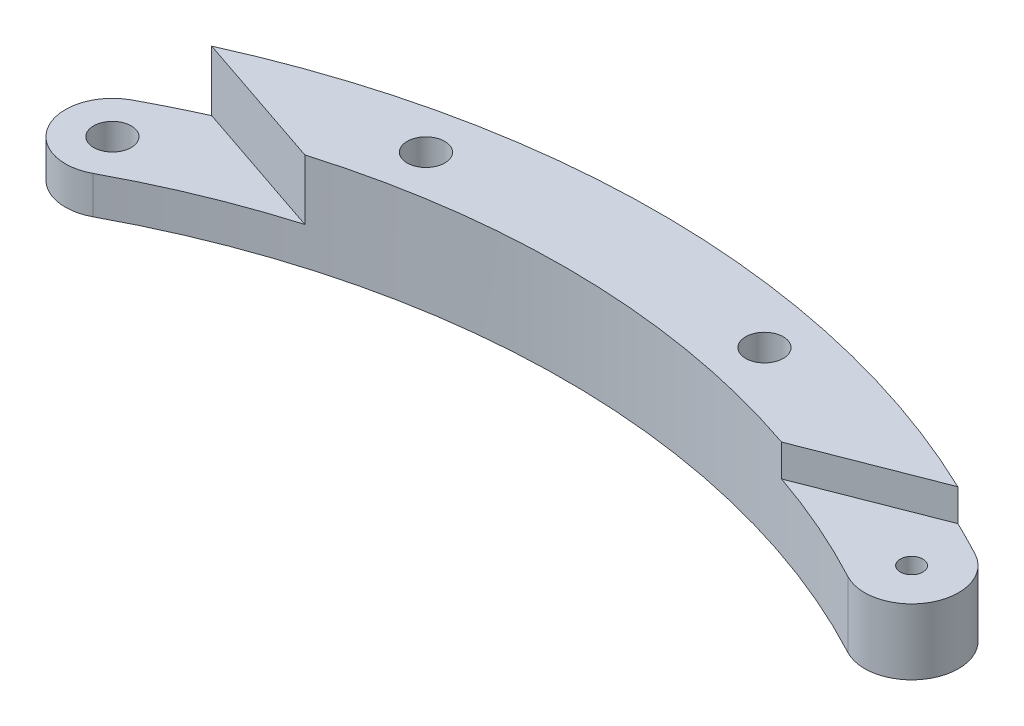
ISO-10303-21;
HEADER;
FILE_DESCRIPTION(('STEP AP214'),'2;1');
FILE_NAME('part.step','',(''),(''),'','','');
FILE_SCHEMA(('AUTOMOTIVE_DESIGN { 1 0 10303 214 1 1 1 1 }'));
ENDSEC;
DATA;
#1=APPLICATION_CONTEXT('core data for automotive mechanical design processes');
#2=APPLICATION_PROTOCOL_DEFINITION('international standard','automotive_design',2000,#1);
#3=PRODUCT_CONTEXT('',#1,'mechanical');
#4=PRODUCT('Part','Part','',(#3));
#5=PRODUCT_RELATED_PRODUCT_CATEGORY('part','',(#4));
#6=PRODUCT_DEFINITION_FORMATION('','',#4);
#7=PRODUCT_DEFINITION_CONTEXT('part definition',#1,'design');
#8=PRODUCT_DEFINITION('design','',#6,#7);
#9=PRODUCT_DEFINITION_SHAPE('','',#8);
#10=(LENGTH_UNIT() NAMED_UNIT(*) SI_UNIT(.MILLI.,.METRE.));
#11=(NAMED_UNIT(*) PLANE_ANGLE_UNIT() SI_UNIT($,.RADIAN.));
#12=(NAMED_UNIT(*) SI_UNIT($,.STERADIAN.) SOLID_ANGLE_UNIT());
#13=UNCERTAINTY_MEASURE_WITH_UNIT(LENGTH_MEASURE(1.E-05),#10,'distance_accuracy_value','');
#14=(GEOMETRIC_REPRESENTATION_CONTEXT(3) GLOBAL_UNCERTAINTY_ASSIGNED_CONTEXT((#13)) GLOBAL_UNIT_ASSIGNED_CONTEXT((#10,
#11,#12)) REPRESENTATION_CONTEXT('',''));
#15=CARTESIAN_POINT('',(0.,0.,0.));
#16=DIRECTION('',(0.,0.,1.));
#17=DIRECTION('',(1.,0.,0.));
#18=AXIS2_PLACEMENT_3D('',#15,#16,#17);
#19=CARTESIAN_POINT('',(0.,2.,0.));
#20=DIRECTION('',(0.,1.,0.));
#21=DIRECTION('',(0.,0.,1.));
#22=AXIS2_PLACEMENT_3D('',#19,#20,#21);
#23=PLANE('',#22);
#24=DIRECTION('',(0.947243114761475,0.,0.320515961438709));
#25=VECTOR('',#24,1.);
#26=CARTESIAN_POINT('',(1.26770156473888,2.,-3.74652661097153));
#27=LINE('',#26,#25);
#28=CARTESIAN_POINT('',(1.67034331371739,2.,-3.61028586635371));
#29=VERTEX_POINT('',#28);
#30=CARTESIAN_POINT('',(9.15765166258084,2.,-1.0768266132576));
#31=VERTEX_POINT('',#30);
#32=EDGE_CURVE('E81',#29,#31,#27,.T.);
#33=ORIENTED_EDGE('',*,*,#32,.F.);
#34=CARTESIAN_POINT('',(21.25,2.,39.6665791315561));
#35=DIRECTION('',(0.,1.,0.));
#36=DIRECTION('',(0.,0.,1.));
#37=AXIS2_PLACEMENT_3D('',#34,#35,#36);
#38=CIRCLE('',#37,47.5);
#39=CARTESIAN_POINT('',(-1.18055555555556,2.,-2.203698840642));
#40=VERTEX_POINT('',#39);
#41=EDGE_CURVE('E154',#40,#29,#38,.F.);
#42=ORIENTED_EDGE('',*,*,#41,.F.);
#43=CARTESIAN_POINT('',(0.,2.,0.));
#44=DIRECTION('',(0.,1.,0.));
#45=DIRECTION('',(0.,0.,1.));
#46=AXIS2_PLACEMENT_3D('',#43,#44,#45);
#47=CIRCLE('',#46,2.5);
#48=CARTESIAN_POINT('',(1.18055555555555,2.,2.203698840642));
#49=VERTEX_POINT('',#48);
#50=EDGE_CURVE('E157',#40,#49,#47,.T.);
#51=ORIENTED_EDGE('',*,*,#50,.T.);
#52=CARTESIAN_POINT('',(21.25,2.,39.6665791315561));
#53=DIRECTION('',(0.,1.,0.));
#54=DIRECTION('',(0.,0.,1.));
#55=AXIS2_PLACEMENT_3D('',#52,#53,#54);
#56=CIRCLE('',#55,42.5);
#57=EDGE_CURVE('E152',#49,#31,#56,.F.);
#58=ORIENTED_EDGE('',*,*,#57,.T.);
#59=EDGE_LOOP('',(#33,#42,#51,#58));
#60=FACE_BOUND('',#59,.T.);
#61=CARTESIAN_POINT('',(0.,2.,0.));
#62=DIRECTION('',(0.,1.,0.));
#63=DIRECTION('',(0.,0.,1.));
#64=AXIS2_PLACEMENT_3D('',#61,#62,#63);
#65=CIRCLE('',#64,1.);
#66=CARTESIAN_POINT('',(0.,2.,1.));
#67=VERTEX_POINT('',#66);
#68=EDGE_CURVE('E159',#67,#67,#65,.T.);
#69=ORIENTED_EDGE('',*,*,#68,.F.);
#70=EDGE_LOOP('',(#69));
#71=FACE_BOUND('',#70,.T.);
#72=ADVANCED_FACE('F58',(#60,#71),#23,.T.);
#73=CARTESIAN_POINT('',(21.25,2.,39.6665791315561));
#74=DIRECTION('',(0.,-1.,0.));
#75=DIRECTION('',(0.,0.,-1.));
#76=AXIS2_PLACEMENT_3D('',#73,#74,#75);
#77=CYLINDRICAL_SURFACE('',#76,42.5);
#78=DIRECTION('',(0.,-1.,0.));
#79=VECTOR('',#78,1.);
#80=CARTESIAN_POINT('',(41.3194444444444,2.,2.203698840642));
#81=LINE('',#80,#79);
#82=CARTESIAN_POINT('',(41.3194444444444,3.5,2.203698840642));
#83=VERTEX_POINT('',#82);
#84=CARTESIAN_POINT('',(41.3194444444444,0.,2.203698840642));
#85=VERTEX_POINT('',#84);
#86=EDGE_CURVE('E12',#83,#85,#81,.T.);
#87=ORIENTED_EDGE('',*,*,#86,.F.);
#88=CARTESIAN_POINT('',(21.25,3.5,39.6665791315561));
#89=DIRECTION('',(0.,1.,0.));
#90=DIRECTION('',(0.,0.,1.));
#91=AXIS2_PLACEMENT_3D('',#88,#89,#90);
#92=CIRCLE('',#91,42.5);
#93=CARTESIAN_POINT('',(35.0535331606691,3.5,-0.529346934182329));
#94=VERTEX_POINT('',#93);
#95=EDGE_CURVE('E126',#83,#94,#92,.T.);
#96=ORIENTED_EDGE('',*,*,#95,.T.);
#97=DIRECTION('',(0.,-1.,0.));
#98=VECTOR('',#97,1.);
#99=CARTESIAN_POINT('',(35.0535331606691,5.2,-0.529346934182329));
#100=LINE('',#99,#98);
#101=CARTESIAN_POINT('',(35.0535331606691,5.2,-0.529346934182329));
#102=VERTEX_POINT('',#101);
#103=EDGE_CURVE('E135',#102,#94,#100,.T.);
#104=ORIENTED_EDGE('',*,*,#103,.F.);
#105=CARTESIAN_POINT('',(21.25,5.2,39.6665791315561));
#106=DIRECTION('',(0.,1.,0.));
#107=DIRECTION('',(0.,0.,1.));
#108=AXIS2_PLACEMENT_3D('',#105,#106,#107);
#109=CIRCLE('',#108,42.5);
#110=CARTESIAN_POINT('',(9.15765166258084,5.2,-1.0768266132576));
#111=VERTEX_POINT('',#110);
#112=EDGE_CURVE('E202',#111,#102,#109,.F.);
#113=ORIENTED_EDGE('',*,*,#112,.F.);
#114=DIRECTION('',(0.,-1.,0.));
#115=VECTOR('',#114,1.);
#116=CARTESIAN_POINT('',(9.15765166258084,5.2,-1.0768266132576));
#117=LINE('',#116,#115);
#118=EDGE_CURVE('E195',#111,#31,#117,.T.);
#119=ORIENTED_EDGE('',*,*,#118,.T.);
#120=ORIENTED_EDGE('',*,*,#57,.F.);
#121=DIRECTION('',(0.,-1.,0.));
#122=VECTOR('',#121,1.);
#123=CARTESIAN_POINT('',(1.18055555555555,2.,2.203698840642));
#124=LINE('',#123,#122);
#125=CARTESIAN_POINT('',(1.18055555555555,0.,2.203698840642));
#126=VERTEX_POINT('',#125);
#127=EDGE_CURVE('E161',#49,#126,#124,.T.);
#128=ORIENTED_EDGE('',*,*,#127,.T.);
#129=CARTESIAN_POINT('',(21.25,0.,39.6665791315561));
#130=DIRECTION('',(0.,1.,0.));
#131=DIRECTION('',(0.,0.,1.));
#132=AXIS2_PLACEMENT_3D('',#129,#130,#131);
#133=CIRCLE('',#132,42.5);
#134=EDGE_CURVE('E143',#126,#85,#133,.F.);
#135=ORIENTED_EDGE('',*,*,#134,.T.);
#136=EDGE_LOOP('',(#87,#96,#104,#113,#119,#120,#128,#135));
#137=FACE_BOUND('',#136,.T.);
#138=ADVANCED_FACE('F60',(#137),#77,.F.);
#139=CARTESIAN_POINT('',(42.5,2.,0.));
#140=DIRECTION('',(0.,-1.,0.));
#141=DIRECTION('',(0.,0.,-1.));
#142=AXIS2_PLACEMENT_3D('',#139,#140,#141);
#143=CYLINDRICAL_SURFACE('',#142,2.49999999999999);
#144=CARTESIAN_POINT('',(42.5,0.,0.));
#145=DIRECTION('',(0.,1.,0.));
#146=DIRECTION('',(0.,0.,1.));
#147=AXIS2_PLACEMENT_3D('',#144,#145,#146);
#148=CIRCLE('',#147,2.49999999999999);
#149=CARTESIAN_POINT('',(43.6805555555556,0.,-2.203698840642));
#150=VERTEX_POINT('',#149);
#151=EDGE_CURVE('E146',#85,#150,#148,.T.);
#152=ORIENTED_EDGE('',*,*,#151,.T.);
#153=DIRECTION('',(0.,-1.,0.));
#154=VECTOR('',#153,1.);
#155=CARTESIAN_POINT('',(43.6805555555556,2.,-2.203698840642));
#156=LINE('',#155,#154);
#157=CARTESIAN_POINT('',(43.6805555555556,3.5,-2.20369884064201));
#158=VERTEX_POINT('',#157);
#159=EDGE_CURVE('E66',#158,#150,#156,.T.);
#160=ORIENTED_EDGE('',*,*,#159,.F.);
#161=CARTESIAN_POINT('',(42.5,3.5,0.));
#162=DIRECTION('',(0.,1.,0.));
#163=DIRECTION('',(0.,0.,1.));
#164=AXIS2_PLACEMENT_3D('',#161,#162,#163);
#165=CIRCLE('',#164,2.5);
#166=EDGE_CURVE('E138',#83,#158,#165,.T.);
#167=ORIENTED_EDGE('',*,*,#166,.F.);
#168=ORIENTED_EDGE('',*,*,#86,.T.);
#169=EDGE_LOOP('',(#152,#160,#167,#168));
#170=FACE_BOUND('',#169,.T.);
#171=ADVANCED_FACE('F182',(#170),#143,.T.);
#172=CARTESIAN_POINT('',(21.25,2.,39.6665791315561));
#173=DIRECTION('',(0.,-1.,0.));
#174=DIRECTION('',(0.,0.,-1.));
#175=AXIS2_PLACEMENT_3D('',#172,#173,#174);
#176=CYLINDRICAL_SURFACE('',#175,47.5);
#177=CARTESIAN_POINT('',(21.25,3.5,39.6665791315561));
#178=DIRECTION('',(0.,1.,0.));
#179=DIRECTION('',(0.,0.,1.));
#180=AXIS2_PLACEMENT_3D('',#177,#178,#179);
#181=CIRCLE('',#180,47.5);
#182=CARTESIAN_POINT('',(41.7985676850436,3.5,-3.1587214055468));
#183=VERTEX_POINT('',#182);
#184=EDGE_CURVE('E73',#158,#183,#181,.T.);
#185=ORIENTED_EDGE('',*,*,#184,.F.);
#186=ORIENTED_EDGE('',*,*,#159,.T.);
#187=CARTESIAN_POINT('',(21.25,0.,39.6665791315561));
#188=DIRECTION('',(0.,1.,0.));
#189=DIRECTION('',(0.,0.,1.));
#190=AXIS2_PLACEMENT_3D('',#187,#188,#189);
#191=CIRCLE('',#190,47.5);
#192=CARTESIAN_POINT('',(-1.18055555555556,0.,-2.203698840642));
#193=VERTEX_POINT('',#192);
#194=EDGE_CURVE('E165',#193,#150,#191,.F.);
#195=ORIENTED_EDGE('',*,*,#194,.F.);
#196=DIRECTION('',(0.,-1.,0.));
#197=VECTOR('',#196,1.);
#198=CARTESIAN_POINT('',(-1.18055555555556,2.,-2.203698840642));
#199=LINE('',#198,#197);
#200=EDGE_CURVE('E177',#40,#193,#199,.T.);
#201=ORIENTED_EDGE('',*,*,#200,.F.);
#202=ORIENTED_EDGE('',*,*,#41,.T.);
#203=DIRECTION('',(0.,-1.,0.));
#204=VECTOR('',#203,1.);
#205=CARTESIAN_POINT('',(1.67034331371739,5.2,-3.61028586635371));
#206=LINE('',#205,#204);
#207=CARTESIAN_POINT('',(1.67034331371739,5.2,-3.61028586635371));
#208=VERTEX_POINT('',#207);
#209=EDGE_CURVE('E148',#208,#29,#206,.T.);
#210=ORIENTED_EDGE('',*,*,#209,.F.);
#211=CARTESIAN_POINT('',(21.25,5.2,39.6665791315561));
#212=DIRECTION('',(0.,1.,0.));
#213=DIRECTION('',(0.,0.,1.));
#214=AXIS2_PLACEMENT_3D('',#211,#212,#213);
#215=CIRCLE('',#214,47.5);
#216=CARTESIAN_POINT('',(41.7985676850436,5.2,-3.1587214055468));
#217=VERTEX_POINT('',#216);
#218=EDGE_CURVE('E210',#217,#208,#215,.T.);
#219=ORIENTED_EDGE('',*,*,#218,.F.);
#220=DIRECTION('',(0.,-1.,0.));
#221=VECTOR('',#220,1.);
#222=CARTESIAN_POINT('',(41.7985676850436,5.2,-3.1587214055468));
#223=LINE('',#222,#221);
#224=EDGE_CURVE('E144',#217,#183,#223,.T.);
#225=ORIENTED_EDGE('',*,*,#224,.T.);
#226=EDGE_LOOP('',(#185,#186,#195,#201,#202,#210,#219,#225));
#227=FACE_BOUND('',#226,.T.);
#228=ADVANCED_FACE('F180',(#227),#176,.T.);
#229=CARTESIAN_POINT('',(0.,2.,0.));
#230=DIRECTION('',(0.,-1.,0.));
#231=DIRECTION('',(0.,0.,-1.));
#232=AXIS2_PLACEMENT_3D('',#229,#230,#231);
#233=CYLINDRICAL_SURFACE('',#232,1.);
#234=ORIENTED_EDGE('',*,*,#68,.T.);
#235=EDGE_LOOP('',(#234));
#236=FACE_BOUND('',#235,.T.);
#237=CARTESIAN_POINT('',(0.,0.,0.));
#238=DIRECTION('',(0.,1.,0.));
#239=DIRECTION('',(0.,0.,1.));
#240=AXIS2_PLACEMENT_3D('',#237,#238,#239);
#241=CIRCLE('',#240,1.);
#242=CARTESIAN_POINT('',(0.,0.,1.));
#243=VERTEX_POINT('',#242);
#244=EDGE_CURVE('E170',#243,#243,#241,.T.);
#245=ORIENTED_EDGE('',*,*,#244,.F.);
#246=EDGE_LOOP('',(#245));
#247=FACE_BOUND('',#246,.T.);
#248=ADVANCED_FACE('F272',(#236,#247),#233,.F.);
#249=CARTESIAN_POINT('',(0.,2.,0.));
#250=DIRECTION('',(0.,-1.,0.));
#251=DIRECTION('',(0.,0.,-1.));
#252=AXIS2_PLACEMENT_3D('',#249,#250,#251);
#253=CYLINDRICAL_SURFACE('',#252,2.5);
#254=CARTESIAN_POINT('',(0.,0.,0.));
#255=DIRECTION('',(0.,1.,0.));
#256=DIRECTION('',(0.,0.,1.));
#257=AXIS2_PLACEMENT_3D('',#254,#255,#256);
#258=CIRCLE('',#257,2.5);
#259=EDGE_CURVE('E168',#193,#126,#258,.T.);
#260=ORIENTED_EDGE('',*,*,#259,.T.);
#261=ORIENTED_EDGE('',*,*,#127,.F.);
#262=ORIENTED_EDGE('',*,*,#50,.F.);
#263=ORIENTED_EDGE('',*,*,#200,.T.);
#264=EDGE_LOOP('',(#260,#261,#262,#263));
#265=FACE_BOUND('',#264,.T.);
#266=ADVANCED_FACE('F190',(#265),#253,.T.);
#267=CARTESIAN_POINT('',(42.5,2.,0.));
#268=DIRECTION('',(0.,-1.,0.));
#269=DIRECTION('',(0.,0.,-1.));
#270=AXIS2_PLACEMENT_3D('',#267,#268,#269);
#271=CYLINDRICAL_SURFACE('',#270,0.600000000000001);
#272=CARTESIAN_POINT('',(42.5,0.,0.));
#273=DIRECTION('',(0.,1.,0.));
#274=DIRECTION('',(0.,0.,1.));
#275=AXIS2_PLACEMENT_3D('',#272,#273,#274);
#276=CIRCLE('',#275,0.600000000000001);
#277=CARTESIAN_POINT('',(42.5,0.,0.600000000000001));
#278=VERTEX_POINT('',#277);
#279=EDGE_CURVE('E155',#278,#278,#276,.T.);
#280=ORIENTED_EDGE('',*,*,#279,.F.);
#281=EDGE_LOOP('',(#280));
#282=FACE_BOUND('',#281,.T.);
#283=CARTESIAN_POINT('',(42.5,3.5,0.));
#284=DIRECTION('',(0.,1.,0.));
#285=DIRECTION('',(0.,0.,1.));
#286=AXIS2_PLACEMENT_3D('',#283,#284,#285);
#287=CIRCLE('',#286,0.600000000000001);
#288=CARTESIAN_POINT('',(42.5,3.5,0.600000000000001));
#289=VERTEX_POINT('',#288);
#290=EDGE_CURVE('E216',#289,#289,#287,.F.);
#291=ORIENTED_EDGE('',*,*,#290,.F.);
#292=EDGE_LOOP('',(#291));
#293=FACE_BOUND('',#292,.T.);
#294=ADVANCED_FACE('F268',(#282,#293),#271,.F.);
#295=CARTESIAN_POINT('',(0.,0.,0.));
#296=DIRECTION('',(0.,1.,0.));
#297=DIRECTION('',(0.,0.,1.));
#298=AXIS2_PLACEMENT_3D('',#295,#296,#297);
#299=PLANE('',#298);
#300=CARTESIAN_POINT('',(12.25,0.,-4.42423623854113));
#301=DIRECTION('',(0.,1.,0.));
#302=DIRECTION('',(0.,0.,1.));
#303=AXIS2_PLACEMENT_3D('',#300,#301,#302);
#304=CIRCLE('',#303,1.);
#305=CARTESIAN_POINT('',(12.25,0.,-3.42423623854113));
#306=VERTEX_POINT('',#305);
#307=EDGE_CURVE('E219',#306,#306,#304,.T.);
#308=ORIENTED_EDGE('',*,*,#307,.T.);
#309=EDGE_LOOP('',(#308));
#310=FACE_BOUND('',#309,.T.);
#311=CARTESIAN_POINT('',(30.25,0.,-4.42423623854113));
#312=DIRECTION('',(0.,1.,0.));
#313=DIRECTION('',(0.,0.,1.));
#314=AXIS2_PLACEMENT_3D('',#311,#312,#313);
#315=CIRCLE('',#314,1.);
#316=CARTESIAN_POINT('',(30.25,0.,-3.42423623854113));
#317=VERTEX_POINT('',#316);
#318=EDGE_CURVE('E220',#317,#317,#315,.T.);
#319=ORIENTED_EDGE('',*,*,#318,.T.);
#320=EDGE_LOOP('',(#319));
#321=FACE_BOUND('',#320,.T.);
#322=ORIENTED_EDGE('',*,*,#134,.F.);
#323=ORIENTED_EDGE('',*,*,#259,.F.);
#324=ORIENTED_EDGE('',*,*,#194,.T.);
#325=ORIENTED_EDGE('',*,*,#151,.F.);
#326=EDGE_LOOP('',(#322,#323,#324,#325));
#327=FACE_BOUND('',#326,.T.);
#328=ORIENTED_EDGE('',*,*,#244,.T.);
#329=EDGE_LOOP('',(#328));
#330=FACE_BOUND('',#329,.T.);
#331=ORIENTED_EDGE('',*,*,#279,.T.);
#332=EDGE_LOOP('',(#331));
#333=FACE_BOUND('',#332,.T.);
#334=ADVANCED_FACE('F186',(#310,#321,#327,#330,#333),#299,.F.);
#335=CARTESIAN_POINT('',(4.44499852775633,5.2,11.4025859979357));
#336=DIRECTION('',(-0.363202716133866,0.,-0.931710141080895));
#337=DIRECTION('',(-0.931710141080896,0.,0.363202716133866));
#338=AXIS2_PLACEMENT_3D('',#335,#336,#337);
#339=PLANE('',#338);
#340=ORIENTED_EDGE('',*,*,#103,.T.);
#341=DIRECTION('',(-0.931710141080896,0.,0.363202716133866));
#342=VECTOR('',#341,1.);
#343=CARTESIAN_POINT('',(41.7985676850436,3.5,-3.1587214055468));
#344=LINE('',#343,#342);
#345=EDGE_CURVE('E123',#183,#94,#344,.T.);
#346=ORIENTED_EDGE('',*,*,#345,.F.);
#347=ORIENTED_EDGE('',*,*,#224,.F.);
#348=DIRECTION('',(0.931710141080896,0.,-0.363202716133866));
#349=VECTOR('',#348,1.);
#350=CARTESIAN_POINT('',(4.44499852775633,5.2,11.4025859979357));
#351=LINE('',#350,#349);
#352=EDGE_CURVE('E141',#102,#217,#351,.T.);
#353=ORIENTED_EDGE('',*,*,#352,.F.);
#354=EDGE_LOOP('',(#340,#346,#347,#353));
#355=FACE_BOUND('',#354,.T.);
#356=ADVANCED_FACE('F140',(#355),#339,.F.);
#357=CARTESIAN_POINT('',(1.26770156473888,5.2,-3.74652661097153));
#358=DIRECTION('',(0.320515961438709,0.,-0.947243114761475));
#359=DIRECTION('',(-0.947243114761475,0.,-0.320515961438709));
#360=AXIS2_PLACEMENT_3D('',#357,#358,#359);
#361=PLANE('',#360);
#362=ORIENTED_EDGE('',*,*,#32,.T.);
#363=ORIENTED_EDGE('',*,*,#118,.F.);
#364=DIRECTION('',(0.947243114761475,0.,0.320515961438709));
#365=VECTOR('',#364,1.);
#366=CARTESIAN_POINT('',(1.26770156473888,5.2,-3.74652661097153));
#367=LINE('',#366,#365);
#368=EDGE_CURVE('E208',#208,#111,#367,.T.);
#369=ORIENTED_EDGE('',*,*,#368,.F.);
#370=ORIENTED_EDGE('',*,*,#209,.T.);
#371=EDGE_LOOP('',(#362,#363,#369,#370));
#372=FACE_BOUND('',#371,.T.);
#373=ADVANCED_FACE('F199',(#372),#361,.F.);
#374=CARTESIAN_POINT('',(0.,5.2,0.));
#375=DIRECTION('',(0.,1.,0.));
#376=DIRECTION('',(0.,0.,1.));
#377=AXIS2_PLACEMENT_3D('',#374,#375,#376);
#378=PLANE('',#377);
#379=CARTESIAN_POINT('',(12.25,5.2,-4.42423623854113));
#380=DIRECTION('',(0.,1.,0.));
#381=DIRECTION('',(0.,0.,1.));
#382=AXIS2_PLACEMENT_3D('',#379,#380,#381);
#383=CIRCLE('',#382,1.);
#384=CARTESIAN_POINT('',(12.25,5.2,-3.42423623854113));
#385=VERTEX_POINT('',#384);
#386=EDGE_CURVE('E226',#385,#385,#383,.T.);
#387=ORIENTED_EDGE('',*,*,#386,.F.);
#388=EDGE_LOOP('',(#387));
#389=FACE_BOUND('',#388,.T.);
#390=CARTESIAN_POINT('',(30.25,5.2,-4.42423623854113));
#391=DIRECTION('',(0.,1.,0.));
#392=DIRECTION('',(0.,0.,1.));
#393=AXIS2_PLACEMENT_3D('',#390,#391,#392);
#394=CIRCLE('',#393,1.);
#395=CARTESIAN_POINT('',(30.25,5.2,-3.42423623854113));
#396=VERTEX_POINT('',#395);
#397=EDGE_CURVE('E223',#396,#396,#394,.T.);
#398=ORIENTED_EDGE('',*,*,#397,.F.);
#399=EDGE_LOOP('',(#398));
#400=FACE_BOUND('',#399,.T.);
#401=ORIENTED_EDGE('',*,*,#112,.T.);
#402=ORIENTED_EDGE('',*,*,#352,.T.);
#403=ORIENTED_EDGE('',*,*,#218,.T.);
#404=ORIENTED_EDGE('',*,*,#368,.T.);
#405=EDGE_LOOP('',(#401,#402,#403,#404));
#406=FACE_BOUND('',#405,.T.);
#407=ADVANCED_FACE('F241',(#389,#400,#406),#378,.T.);
#408=CARTESIAN_POINT('',(21.25,3.5,39.6665791315561));
#409=DIRECTION('',(0.,1.,0.));
#410=DIRECTION('',(0.,0.,1.));
#411=AXIS2_PLACEMENT_3D('',#408,#409,#410);
#412=PLANE('',#411);
#413=ORIENTED_EDGE('',*,*,#290,.T.);
#414=EDGE_LOOP('',(#413));
#415=FACE_BOUND('',#414,.T.);
#416=ORIENTED_EDGE('',*,*,#184,.T.);
#417=ORIENTED_EDGE('',*,*,#345,.T.);
#418=ORIENTED_EDGE('',*,*,#95,.F.);
#419=ORIENTED_EDGE('',*,*,#166,.T.);
#420=EDGE_LOOP('',(#416,#417,#418,#419));
#421=FACE_BOUND('',#420,.T.);
#422=ADVANCED_FACE('F125',(#415,#421),#412,.T.);
#423=CARTESIAN_POINT('',(30.25,0.,-4.42423623854113));
#424=DIRECTION('',(0.,1.,0.));
#425=DIRECTION('',(0.,0.,1.));
#426=AXIS2_PLACEMENT_3D('',#423,#424,#425);
#427=CYLINDRICAL_SURFACE('',#426,1.);
#428=ORIENTED_EDGE('',*,*,#318,.F.);
#429=EDGE_LOOP('',(#428));
#430=FACE_BOUND('',#429,.T.);
#431=ORIENTED_EDGE('',*,*,#397,.T.);
#432=EDGE_LOOP('',(#431));
#433=FACE_BOUND('',#432,.T.);
#434=ADVANCED_FACE('F237',(#430,#433),#427,.F.);
#435=CARTESIAN_POINT('',(12.25,0.,-4.42423623854113));
#436=DIRECTION('',(0.,1.,0.));
#437=DIRECTION('',(0.,0.,1.));
#438=AXIS2_PLACEMENT_3D('',#435,#436,#437);
#439=CYLINDRICAL_SURFACE('',#438,1.);
#440=ORIENTED_EDGE('',*,*,#307,.F.);
#441=EDGE_LOOP('',(#440));
#442=FACE_BOUND('',#441,.T.);
#443=ORIENTED_EDGE('',*,*,#386,.T.);
#444=EDGE_LOOP('',(#443));
#445=FACE_BOUND('',#444,.T.);
#446=ADVANCED_FACE('F234',(#442,#445),#439,.F.);
#447=CLOSED_SHELL('',(#72,#138,#171,#228,#248,#266,#294,#334,#356,#373,#407,#422,#434,#446));
#448=MANIFOLD_SOLID_BREP('B2',#447);
#449=ADVANCED_BREP_SHAPE_REPRESENTATION('',(#18,#448),#14);
#450=SHAPE_DEFINITION_REPRESENTATION(#9,#449);
ENDSEC;
END-ISO-10303-21;
